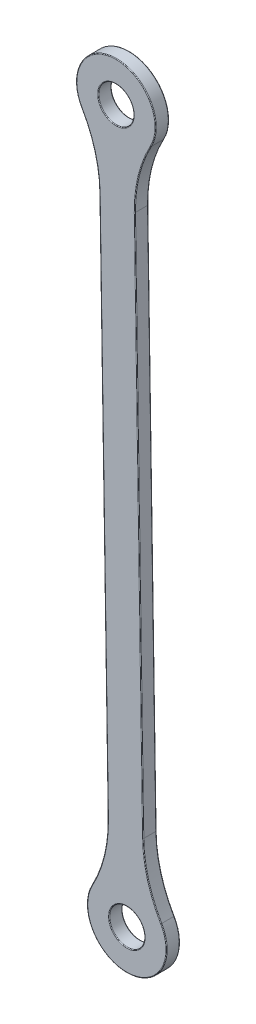
ISO-10303-21;
HEADER;
FILE_DESCRIPTION(('STEP AP214'),'2;1');
FILE_NAME('part.step','',(''),(''),'','','');
FILE_SCHEMA(('AUTOMOTIVE_DESIGN { 1 0 10303 214 1 1 1 1 }'));
ENDSEC;
DATA;
#1=APPLICATION_CONTEXT('core data for automotive mechanical design processes');
#2=APPLICATION_PROTOCOL_DEFINITION('international standard','automotive_design',2000,#1);
#3=PRODUCT_CONTEXT('',#1,'mechanical');
#4=PRODUCT('Part','Part','',(#3));
#5=PRODUCT_RELATED_PRODUCT_CATEGORY('part','',(#4));
#6=PRODUCT_DEFINITION_FORMATION('','',#4);
#7=PRODUCT_DEFINITION_CONTEXT('part definition',#1,'design');
#8=PRODUCT_DEFINITION('design','',#6,#7);
#9=PRODUCT_DEFINITION_SHAPE('','',#8);
#10=(LENGTH_UNIT() NAMED_UNIT(*) SI_UNIT(.MILLI.,.METRE.));
#11=(NAMED_UNIT(*) PLANE_ANGLE_UNIT() SI_UNIT($,.RADIAN.));
#12=(NAMED_UNIT(*) SI_UNIT($,.STERADIAN.) SOLID_ANGLE_UNIT());
#13=UNCERTAINTY_MEASURE_WITH_UNIT(LENGTH_MEASURE(1.E-05),#10,'distance_accuracy_value','');
#14=(GEOMETRIC_REPRESENTATION_CONTEXT(3) GLOBAL_UNCERTAINTY_ASSIGNED_CONTEXT((#13)) GLOBAL_UNIT_ASSIGNED_CONTEXT((#10,
#11,#12)) REPRESENTATION_CONTEXT('',''));
#15=CARTESIAN_POINT('',(0.,0.,0.));
#16=DIRECTION('',(0.,0.,1.));
#17=DIRECTION('',(1.,0.,0.));
#18=AXIS2_PLACEMENT_3D('',#15,#16,#17);
#19=CARTESIAN_POINT('',(33.7800000295671,57.2783388585903,-3.));
#20=DIRECTION('',(0.,0.,1.));
#21=DIRECTION('',(1.,0.,0.));
#22=AXIS2_PLACEMENT_3D('',#19,#20,#21);
#23=CYLINDRICAL_SURFACE('',#22,9.00000000000001);
#24=DIRECTION('',(0.,0.,1.));
#25=VECTOR('',#24,1.);
#26=CARTESIAN_POINT('',(25.8667733867678,61.5656275238999,-3.));
#27=LINE('',#26,#25);
#28=CARTESIAN_POINT('',(25.8667733867678,61.5656275238999,-0.15));
#29=VERTEX_POINT('',#28);
#30=CARTESIAN_POINT('',(25.8667733867678,61.5656275238999,-2.85));
#31=VERTEX_POINT('',#30);
#32=EDGE_CURVE('E301',#29,#31,#27,.F.);
#33=ORIENTED_EDGE('',*,*,#32,.T.);
#34=CARTESIAN_POINT('',(33.7800000295671,57.2783388585903,-2.85));
#35=DIRECTION('',(0.,0.,1.));
#36=DIRECTION('',(1.,0.,0.));
#37=AXIS2_PLACEMENT_3D('',#34,#35,#36);
#38=CIRCLE('',#37,9.00000000000001);
#39=CARTESIAN_POINT('',(41.5572141324783,61.8076810622087,-2.85));
#40=VERTEX_POINT('',#39);
#41=EDGE_CURVE('E223',#31,#40,#38,.T.);
#42=ORIENTED_EDGE('',*,*,#41,.T.);
#43=DIRECTION('',(0.,0.,1.));
#44=VECTOR('',#43,1.);
#45=CARTESIAN_POINT('',(41.5572141324783,61.8076810622087,-3.));
#46=LINE('',#45,#44);
#47=CARTESIAN_POINT('',(41.5572141324783,61.8076810622087,-0.15));
#48=VERTEX_POINT('',#47);
#49=EDGE_CURVE('E295',#40,#48,#46,.T.);
#50=ORIENTED_EDGE('',*,*,#49,.T.);
#51=CARTESIAN_POINT('',(33.7800000295671,57.2783388585903,-0.15));
#52=DIRECTION('',(0.,0.,1.));
#53=DIRECTION('',(1.,0.,0.));
#54=AXIS2_PLACEMENT_3D('',#51,#52,#53);
#55=CIRCLE('',#54,9.00000000000001);
#56=EDGE_CURVE('E221',#48,#29,#55,.F.);
#57=ORIENTED_EDGE('',*,*,#56,.T.);
#58=EDGE_LOOP('',(#33,#42,#50,#57));
#59=FACE_BOUND('',#58,.T.);
#60=ADVANCED_FACE('F35',(#59),#23,.T.);
#61=CARTESIAN_POINT('',(30.6558507811795,0.47292216144272,-3.));
#62=DIRECTION('',(0.999881027912922,0.0154249803824219,0.));
#63=DIRECTION('',(-0.0154249803824219,0.999881027912922,0.));
#64=AXIS2_PLACEMENT_3D('',#61,#62,#63);
#65=PLANE('',#64);
#66=DIRECTION('',(0.,0.,1.));
#67=VECTOR('',#66,1.);
#68=CARTESIAN_POINT('',(27.6071728933693,198.094903173027,-3.));
#69=LINE('',#68,#67);
#70=CARTESIAN_POINT('',(27.6071728933693,198.094903173027,-0.15));
#71=VERTEX_POINT('',#70);
#72=CARTESIAN_POINT('',(27.6071728933693,198.094903173027,-2.85));
#73=VERTEX_POINT('',#72);
#74=EDGE_CURVE('E258',#71,#73,#69,.F.);
#75=ORIENTED_EDGE('',*,*,#74,.T.);
#76=DIRECTION('',(-0.0154249803824219,0.999881027912922,0.));
#77=VECTOR('',#76,1.);
#78=CARTESIAN_POINT('',(30.6558507811795,0.47292216144272,-2.85));
#79=LINE('',#78,#77);
#80=CARTESIAN_POINT('',(29.4857820814914,76.3193391530712,-2.85));
#81=VERTEX_POINT('',#80);
#82=EDGE_CURVE('E215',#73,#81,#79,.F.);
#83=ORIENTED_EDGE('',*,*,#82,.T.);
#84=DIRECTION('',(0.,0.,1.));
#85=VECTOR('',#84,1.);
#86=CARTESIAN_POINT('',(29.4857820814914,76.3193391530712,-3.));
#87=LINE('',#86,#85);
#88=CARTESIAN_POINT('',(29.4857820814914,76.3193391530712,-0.15));
#89=VERTEX_POINT('',#88);
#90=EDGE_CURVE('E302',#81,#89,#87,.T.);
#91=ORIENTED_EDGE('',*,*,#90,.T.);
#92=DIRECTION('',(-0.0154249803824219,0.999881027912922,0.));
#93=VECTOR('',#92,1.);
#94=CARTESIAN_POINT('',(27.6071728933693,198.094903173027,-0.15));
#95=LINE('',#94,#93);
#96=EDGE_CURVE('E213',#89,#71,#95,.T.);
#97=ORIENTED_EDGE('',*,*,#96,.T.);
#98=EDGE_LOOP('',(#75,#83,#91,#97));
#99=FACE_BOUND('',#98,.T.);
#100=ADVANCED_FACE('F371',(#99),#65,.F.);
#101=CARTESIAN_POINT('',(31.312003168597,217.259303310567,-3.));
#102=DIRECTION('',(0.,0.,1.));
#103=DIRECTION('',(1.,0.,0.));
#104=AXIS2_PLACEMENT_3D('',#101,#102,#103);
#105=CYLINDRICAL_SURFACE('',#104,9.00000000000004);
#106=DIRECTION('',(0.,0.,1.));
#107=VECTOR('',#106,1.);
#108=CARTESIAN_POINT('',(39.2252298113962,212.972014645257,-3.));
#109=LINE('',#108,#107);
#110=CARTESIAN_POINT('',(39.2252298113962,212.972014645257,-0.15));
#111=VERTEX_POINT('',#110);
#112=CARTESIAN_POINT('',(39.2252298113962,212.972014645257,-2.85));
#113=VERTEX_POINT('',#112);
#114=EDGE_CURVE('E316',#111,#113,#109,.F.);
#115=ORIENTED_EDGE('',*,*,#114,.T.);
#116=CARTESIAN_POINT('',(31.312003168597,217.259303310567,-2.85));
#117=DIRECTION('',(0.,0.,1.));
#118=DIRECTION('',(1.,0.,0.));
#119=AXIS2_PLACEMENT_3D('',#116,#117,#118);
#120=CIRCLE('',#119,9.00000000000004);
#121=CARTESIAN_POINT('',(23.5347890656857,212.729961106949,-2.85));
#122=VERTEX_POINT('',#121);
#123=EDGE_CURVE('E206',#113,#122,#120,.T.);
#124=ORIENTED_EDGE('',*,*,#123,.T.);
#125=DIRECTION('',(0.,0.,1.));
#126=VECTOR('',#125,1.);
#127=CARTESIAN_POINT('',(23.5347890656857,212.729961106949,-3.));
#128=LINE('',#127,#126);
#129=CARTESIAN_POINT('',(23.5347890656857,212.729961106949,-0.15));
#130=VERTEX_POINT('',#129);
#131=EDGE_CURVE('E313',#122,#130,#128,.T.);
#132=ORIENTED_EDGE('',*,*,#131,.T.);
#133=CARTESIAN_POINT('',(31.312003168597,217.259303310567,-0.15));
#134=DIRECTION('',(0.,0.,1.));
#135=DIRECTION('',(1.,0.,0.));
#136=AXIS2_PLACEMENT_3D('',#133,#134,#135);
#137=CIRCLE('',#136,9.00000000000004);
#138=EDGE_CURVE('E204',#130,#111,#137,.F.);
#139=ORIENTED_EDGE('',*,*,#138,.T.);
#140=EDGE_LOOP('',(#115,#124,#132,#139));
#141=FACE_BOUND('',#140,.T.);
#142=ADVANCED_FACE('F387',(#141),#105,.T.);
#143=CARTESIAN_POINT('',(31.312003168597,217.259303310567,-3.));
#144=DIRECTION('',(0.,0.,1.));
#145=DIRECTION('',(1.,0.,0.));
#146=AXIS2_PLACEMENT_3D('',#143,#144,#145);
#147=CYLINDRICAL_SURFACE('',#146,4.);
#148=CARTESIAN_POINT('',(31.312003168597,217.259303310567,-2.85));
#149=DIRECTION('',(0.,0.,1.));
#150=DIRECTION('',(1.,0.,0.));
#151=AXIS2_PLACEMENT_3D('',#148,#149,#150);
#152=CIRCLE('',#151,4.);
#153=CARTESIAN_POINT('',(35.312003168597,217.259303310567,-2.85));
#154=VERTEX_POINT('',#153);
#155=EDGE_CURVE('E190',#154,#154,#152,.F.);
#156=ORIENTED_EDGE('',*,*,#155,.T.);
#157=EDGE_LOOP('',(#156));
#158=FACE_BOUND('',#157,.T.);
#159=CARTESIAN_POINT('',(31.312003168597,217.259303310567,-0.15));
#160=DIRECTION('',(0.,0.,1.));
#161=DIRECTION('',(1.,0.,0.));
#162=AXIS2_PLACEMENT_3D('',#159,#160,#161);
#163=CIRCLE('',#162,4.);
#164=CARTESIAN_POINT('',(35.312003168597,217.259303310567,-0.15));
#165=VERTEX_POINT('',#164);
#166=EDGE_CURVE('E187',#165,#165,#163,.T.);
#167=ORIENTED_EDGE('',*,*,#166,.T.);
#168=EDGE_LOOP('',(#167));
#169=FACE_BOUND('',#168,.T.);
#170=ADVANCED_FACE('F389',(#158,#169),#147,.F.);
#171=CARTESIAN_POINT('',(38.6548990044828,0.596322004502095,-3.));
#172=DIRECTION('',(0.999881027912922,0.0154249803824219,0.));
#173=DIRECTION('',(-0.0154249803824219,0.999881027912922,0.));
#174=AXIS2_PLACEMENT_3D('',#171,#172,#173);
#175=PLANE('',#174);
#176=DIRECTION('',(0.,0.,-1.));
#177=VECTOR('',#176,1.);
#178=CARTESIAN_POINT('',(37.4848303047948,76.4427389961306,-3.));
#179=LINE('',#178,#177);
#180=CARTESIAN_POINT('',(37.4848303047948,76.4427389961306,-0.15));
#181=VERTEX_POINT('',#180);
#182=CARTESIAN_POINT('',(37.4848303047948,76.4427389961306,-2.85));
#183=VERTEX_POINT('',#182);
#184=EDGE_CURVE('E297',#181,#183,#179,.T.);
#185=ORIENTED_EDGE('',*,*,#184,.T.);
#186=DIRECTION('',(-0.0154249803824219,0.999881027912922,0.));
#187=VECTOR('',#186,1.);
#188=CARTESIAN_POINT('',(35.6062211166727,198.218303016086,-2.85));
#189=LINE('',#188,#187);
#190=CARTESIAN_POINT('',(35.6062211166727,198.218303016086,-2.85));
#191=VERTEX_POINT('',#190);
#192=EDGE_CURVE('E198',#183,#191,#189,.T.);
#193=ORIENTED_EDGE('',*,*,#192,.T.);
#194=DIRECTION('',(0.,0.,-1.));
#195=VECTOR('',#194,1.);
#196=CARTESIAN_POINT('',(35.6062211166727,198.218303016086,0.));
#197=LINE('',#196,#195);
#198=CARTESIAN_POINT('',(35.6062211166727,198.218303016086,-0.15));
#199=VERTEX_POINT('',#198);
#200=EDGE_CURVE('E304',#191,#199,#197,.F.);
#201=ORIENTED_EDGE('',*,*,#200,.T.);
#202=DIRECTION('',(-0.0154249803824219,0.999881027912922,0.));
#203=VECTOR('',#202,1.);
#204=CARTESIAN_POINT('',(38.6548990044828,0.596322004502095,-0.15));
#205=LINE('',#204,#203);
#206=EDGE_CURVE('E196',#199,#181,#205,.F.);
#207=ORIENTED_EDGE('',*,*,#206,.T.);
#208=EDGE_LOOP('',(#185,#193,#201,#207));
#209=FACE_BOUND('',#208,.T.);
#210=ADVANCED_FACE('F342',(#209),#175,.T.);
#211=CARTESIAN_POINT('',(33.7800000295671,57.2783388585903,-3.));
#212=DIRECTION('',(0.,0.,1.));
#213=DIRECTION('',(1.,0.,0.));
#214=AXIS2_PLACEMENT_3D('',#211,#212,#213);
#215=CYLINDRICAL_SURFACE('',#214,4.);
#216=CARTESIAN_POINT('',(33.7800000295671,57.2783388585903,-2.85));
#217=DIRECTION('',(0.,0.,1.));
#218=DIRECTION('',(1.,0.,0.));
#219=AXIS2_PLACEMENT_3D('',#216,#217,#218);
#220=CIRCLE('',#219,4.);
#221=CARTESIAN_POINT('',(37.7800000295671,57.2783388585903,-2.85));
#222=VERTEX_POINT('',#221);
#223=EDGE_CURVE('E170',#222,#222,#220,.F.);
#224=ORIENTED_EDGE('',*,*,#223,.T.);
#225=EDGE_LOOP('',(#224));
#226=FACE_BOUND('',#225,.T.);
#227=CARTESIAN_POINT('',(33.7800000295671,57.2783388585903,-0.15));
#228=DIRECTION('',(0.,0.,1.));
#229=DIRECTION('',(1.,0.,0.));
#230=AXIS2_PLACEMENT_3D('',#227,#228,#229);
#231=CIRCLE('',#230,4.);
#232=CARTESIAN_POINT('',(37.7800000295671,57.2783388585903,-0.15));
#233=VERTEX_POINT('',#232);
#234=EDGE_CURVE('E319',#233,#233,#231,.T.);
#235=ORIENTED_EDGE('',*,*,#234,.T.);
#236=EDGE_LOOP('',(#235));
#237=FACE_BOUND('',#236,.T.);
#238=ADVANCED_FACE('F545',(#226,#237),#215,.F.);
#239=CARTESIAN_POINT('',(0.,0.,-3.));
#240=DIRECTION('',(0.,0.,1.));
#241=DIRECTION('',(1.,0.,0.));
#242=AXIS2_PLACEMENT_3D('',#239,#240,#241);
#243=PLANE('',#242);
#244=CARTESIAN_POINT('',(33.7800000295671,57.2783388585903,-3.));
#245=DIRECTION('',(0.,0.,1.));
#246=DIRECTION('',(1.,0.,0.));
#247=AXIS2_PLACEMENT_3D('',#244,#245,#246);
#248=CIRCLE('',#247,4.15);
#249=CARTESIAN_POINT('',(37.9300000295671,57.2783388585903,-3.));
#250=VERTEX_POINT('',#249);
#251=EDGE_CURVE('E179',#250,#250,#248,.T.);
#252=ORIENTED_EDGE('',*,*,#251,.T.);
#253=EDGE_LOOP('',(#252));
#254=FACE_BOUND('',#253,.T.);
#255=CARTESIAN_POINT('',(31.312003168597,217.259303310567,-3.));
#256=DIRECTION('',(0.,0.,1.));
#257=DIRECTION('',(1.,0.,0.));
#258=AXIS2_PLACEMENT_3D('',#255,#256,#257);
#259=CIRCLE('',#258,4.15);
#260=CARTESIAN_POINT('',(35.462003168597,217.259303310567,-3.));
#261=VERTEX_POINT('',#260);
#262=EDGE_CURVE('E176',#261,#261,#259,.T.);
#263=ORIENTED_EDGE('',*,*,#262,.T.);
#264=EDGE_LOOP('',(#263));
#265=FACE_BOUND('',#264,.T.);
#266=DIRECTION('',(-0.0154249803824219,0.999881027912922,0.));
#267=VECTOR('',#266,1.);
#268=CARTESIAN_POINT('',(37.3348481506078,76.4404252490733,-3.));
#269=LINE('',#268,#267);
#270=CARTESIAN_POINT('',(35.4562389624857,198.215989269029,-3.));
#271=VERTEX_POINT('',#270);
#272=CARTESIAN_POINT('',(37.3348481506078,76.4404252490733,-3.));
#273=VERTEX_POINT('',#272);
#274=EDGE_CURVE('E174',#271,#273,#269,.F.);
#275=ORIENTED_EDGE('',*,*,#274,.T.);
#276=CARTESIAN_POINT('',(67.4812611421824,76.9054884076033,-3.));
#277=DIRECTION('',(0.,0.,1.));
#278=DIRECTION('',(1.,0.,0.));
#279=AXIS2_PLACEMENT_3D('',#276,#277,#278);
#280=CIRCLE('',#279,30.15);
#281=CARTESIAN_POINT('',(41.4275938974298,61.7321920254817,-3.));
#282=VERTEX_POINT('',#281);
#283=EDGE_CURVE('E155',#273,#282,#280,.T.);
#284=ORIENTED_EDGE('',*,*,#283,.T.);
#285=CARTESIAN_POINT('',(33.7800000295671,57.2783388585903,-3.));
#286=DIRECTION('',(0.,0.,1.));
#287=DIRECTION('',(1.,0.,0.));
#288=AXIS2_PLACEMENT_3D('',#285,#286,#287);
#289=CIRCLE('',#288,8.85000000000001);
#290=CARTESIAN_POINT('',(25.9986604974812,61.4941727128114,-3.));
#291=VERTEX_POINT('',#290);
#292=EDGE_CURVE('E163',#282,#291,#289,.F.);
#293=ORIENTED_EDGE('',*,*,#292,.T.);
#294=CARTESIAN_POINT('',(-0.510648755896287,75.8565897415986,-3.));
#295=DIRECTION('',(0.,0.,1.));
#296=DIRECTION('',(1.,0.,0.));
#297=AXIS2_PLACEMENT_3D('',#294,#295,#296);
#298=CIRCLE('',#297,30.15);
#299=CARTESIAN_POINT('',(29.6357642356783,76.3216529001286,-3.));
#300=VERTEX_POINT('',#299);
#301=EDGE_CURVE('E169',#291,#300,#298,.T.);
#302=ORIENTED_EDGE('',*,*,#301,.T.);
#303=DIRECTION('',(-0.0154249803824219,0.999881027912922,0.));
#304=VECTOR('',#303,1.);
#305=CARTESIAN_POINT('',(30.8058329353664,0.475235908500083,-3.));
#306=LINE('',#305,#304);
#307=CARTESIAN_POINT('',(27.7571550475562,198.097216920084,-3.));
#308=VERTEX_POINT('',#307);
#309=EDGE_CURVE('E325',#300,#308,#306,.T.);
#310=ORIENTED_EDGE('',*,*,#309,.T.);
#311=CARTESIAN_POINT('',(-2.38925794401838,197.632153761554,-3.));
#312=DIRECTION('',(0.,0.,1.));
#313=DIRECTION('',(1.,0.,0.));
#314=AXIS2_PLACEMENT_3D('',#311,#312,#313);
#315=CIRCLE('',#314,30.15);
#316=CARTESIAN_POINT('',(23.6644093007342,212.805450143676,-3.));
#317=VERTEX_POINT('',#316);
#318=EDGE_CURVE('E327',#308,#317,#315,.T.);
#319=ORIENTED_EDGE('',*,*,#318,.T.);
#320=CARTESIAN_POINT('',(31.312003168597,217.259303310567,-3.));
#321=DIRECTION('',(0.,0.,1.));
#322=DIRECTION('',(1.,0.,0.));
#323=AXIS2_PLACEMENT_3D('',#320,#321,#322);
#324=CIRCLE('',#323,8.85000000000004);
#325=CARTESIAN_POINT('',(39.0933427006829,213.043469456346,-3.));
#326=VERTEX_POINT('',#325);
#327=EDGE_CURVE('E329',#317,#326,#324,.F.);
#328=ORIENTED_EDGE('',*,*,#327,.T.);
#329=CARTESIAN_POINT('',(65.6026519540603,198.681052427559,-3.));
#330=DIRECTION('',(0.,0.,1.));
#331=DIRECTION('',(1.,0.,0.));
#332=AXIS2_PLACEMENT_3D('',#329,#330,#331);
#333=CIRCLE('',#332,30.15);
#334=EDGE_CURVE('E181',#326,#271,#333,.T.);
#335=ORIENTED_EDGE('',*,*,#334,.T.);
#336=EDGE_LOOP('',(#275,#284,#293,#302,#310,#319,#328,#335));
#337=FACE_BOUND('',#336,.T.);
#338=ADVANCED_FACE('F172',(#254,#265,#337),#243,.F.);
#339=CARTESIAN_POINT('',(0.,0.,0.));
#340=DIRECTION('',(0.,0.,1.));
#341=DIRECTION('',(1.,0.,0.));
#342=AXIS2_PLACEMENT_3D('',#339,#340,#341);
#343=PLANE('',#342);
#344=CARTESIAN_POINT('',(33.7800000295671,57.2783388585903,0.));
#345=DIRECTION('',(0.,0.,1.));
#346=DIRECTION('',(1.,0.,0.));
#347=AXIS2_PLACEMENT_3D('',#344,#345,#346);
#348=CIRCLE('',#347,4.15);
#349=CARTESIAN_POINT('',(37.9300000295671,57.2783388585903,0.));
#350=VERTEX_POINT('',#349);
#351=EDGE_CURVE('E11',#350,#350,#348,.F.);
#352=ORIENTED_EDGE('',*,*,#351,.T.);
#353=EDGE_LOOP('',(#352));
#354=FACE_BOUND('',#353,.T.);
#355=CARTESIAN_POINT('',(31.312003168597,217.259303310567,0.));
#356=DIRECTION('',(0.,0.,1.));
#357=DIRECTION('',(1.,0.,0.));
#358=AXIS2_PLACEMENT_3D('',#355,#356,#357);
#359=CIRCLE('',#358,4.15);
#360=CARTESIAN_POINT('',(35.462003168597,217.259303310567,0.));
#361=VERTEX_POINT('',#360);
#362=EDGE_CURVE('E44',#361,#361,#359,.F.);
#363=ORIENTED_EDGE('',*,*,#362,.T.);
#364=EDGE_LOOP('',(#363));
#365=FACE_BOUND('',#364,.T.);
#366=CARTESIAN_POINT('',(31.312003168597,217.259303310567,0.));
#367=DIRECTION('',(0.,0.,1.));
#368=DIRECTION('',(1.,0.,0.));
#369=AXIS2_PLACEMENT_3D('',#366,#367,#368);
#370=CIRCLE('',#369,8.85000000000004);
#371=CARTESIAN_POINT('',(39.0933427006829,213.043469456346,0.));
#372=VERTEX_POINT('',#371);
#373=CARTESIAN_POINT('',(23.6644093007342,212.805450143676,0.));
#374=VERTEX_POINT('',#373);
#375=EDGE_CURVE('E52',#372,#374,#370,.T.);
#376=ORIENTED_EDGE('',*,*,#375,.T.);
#377=CARTESIAN_POINT('',(-2.38925794401838,197.632153761554,0.));
#378=DIRECTION('',(0.,0.,1.));
#379=DIRECTION('',(1.,0.,0.));
#380=AXIS2_PLACEMENT_3D('',#377,#378,#379);
#381=CIRCLE('',#380,30.15);
#382=CARTESIAN_POINT('',(27.7571550475562,198.097216920084,0.));
#383=VERTEX_POINT('',#382);
#384=EDGE_CURVE('E237',#374,#383,#381,.F.);
#385=ORIENTED_EDGE('',*,*,#384,.T.);
#386=DIRECTION('',(-0.0154249803824219,0.999881027912922,0.));
#387=VECTOR('',#386,1.);
#388=CARTESIAN_POINT('',(29.6357642356783,76.3216529001286,0.));
#389=LINE('',#388,#387);
#390=CARTESIAN_POINT('',(29.6357642356783,76.3216529001286,0.));
#391=VERTEX_POINT('',#390);
#392=EDGE_CURVE('E225',#383,#391,#389,.F.);
#393=ORIENTED_EDGE('',*,*,#392,.T.);
#394=CARTESIAN_POINT('',(-0.510648755896287,75.8565897415986,0.));
#395=DIRECTION('',(0.,0.,1.));
#396=DIRECTION('',(1.,0.,0.));
#397=AXIS2_PLACEMENT_3D('',#394,#395,#396);
#398=CIRCLE('',#397,30.15);
#399=CARTESIAN_POINT('',(25.9986604974812,61.4941727128114,0.));
#400=VERTEX_POINT('',#399);
#401=EDGE_CURVE('E227',#391,#400,#398,.F.);
#402=ORIENTED_EDGE('',*,*,#401,.T.);
#403=CARTESIAN_POINT('',(33.7800000295671,57.2783388585903,0.));
#404=DIRECTION('',(0.,0.,1.));
#405=DIRECTION('',(1.,0.,0.));
#406=AXIS2_PLACEMENT_3D('',#403,#404,#405);
#407=CIRCLE('',#406,8.85000000000001);
#408=CARTESIAN_POINT('',(41.4275938974298,61.7321920254817,0.));
#409=VERTEX_POINT('',#408);
#410=EDGE_CURVE('E229',#400,#409,#407,.T.);
#411=ORIENTED_EDGE('',*,*,#410,.T.);
#412=CARTESIAN_POINT('',(67.4812611421824,76.9054884076033,0.));
#413=DIRECTION('',(0.,0.,1.));
#414=DIRECTION('',(1.,0.,0.));
#415=AXIS2_PLACEMENT_3D('',#412,#413,#414);
#416=CIRCLE('',#415,30.15);
#417=CARTESIAN_POINT('',(37.3348481506078,76.4404252490733,0.));
#418=VERTEX_POINT('',#417);
#419=EDGE_CURVE('E231',#409,#418,#416,.F.);
#420=ORIENTED_EDGE('',*,*,#419,.T.);
#421=DIRECTION('',(-0.0154249803824219,0.999881027912922,0.));
#422=VECTOR('',#421,1.);
#423=CARTESIAN_POINT('',(38.5049168502959,0.594008257444732,0.));
#424=LINE('',#423,#422);
#425=CARTESIAN_POINT('',(35.4562389624857,198.215989269029,0.));
#426=VERTEX_POINT('',#425);
#427=EDGE_CURVE('E233',#418,#426,#424,.T.);
#428=ORIENTED_EDGE('',*,*,#427,.T.);
#429=CARTESIAN_POINT('',(65.6026519540603,198.681052427559,0.));
#430=DIRECTION('',(0.,0.,1.));
#431=DIRECTION('',(1.,0.,0.));
#432=AXIS2_PLACEMENT_3D('',#429,#430,#431);
#433=CIRCLE('',#432,30.15);
#434=EDGE_CURVE('E57',#426,#372,#433,.F.);
#435=ORIENTED_EDGE('',*,*,#434,.T.);
#436=EDGE_LOOP('',(#376,#385,#393,#402,#411,#420,#428,#435));
#437=FACE_BOUND('',#436,.T.);
#438=ADVANCED_FACE('F358',(#354,#365,#437),#343,.T.);
#439=CARTESIAN_POINT('',(-0.510648755896287,75.8565897415986,-3.));
#440=DIRECTION('',(0.,0.,1.));
#441=DIRECTION('',(1.,0.,0.));
#442=AXIS2_PLACEMENT_3D('',#439,#440,#441);
#443=CYLINDRICAL_SURFACE('',#442,30.);
#444=ORIENTED_EDGE('',*,*,#90,.F.);
#445=CARTESIAN_POINT('',(-0.510648755896287,75.8565897415986,-2.85));
#446=DIRECTION('',(0.,0.,1.));
#447=DIRECTION('',(1.,0.,0.));
#448=AXIS2_PLACEMENT_3D('',#445,#446,#447);
#449=CIRCLE('',#448,30.);
#450=EDGE_CURVE('E219',#81,#31,#449,.F.);
#451=ORIENTED_EDGE('',*,*,#450,.T.);
#452=ORIENTED_EDGE('',*,*,#32,.F.);
#453=CARTESIAN_POINT('',(-0.510648755896287,75.8565897415986,-0.15));
#454=DIRECTION('',(0.,0.,1.));
#455=DIRECTION('',(1.,0.,0.));
#456=AXIS2_PLACEMENT_3D('',#453,#454,#455);
#457=CIRCLE('',#456,30.);
#458=EDGE_CURVE('E217',#29,#89,#457,.T.);
#459=ORIENTED_EDGE('',*,*,#458,.T.);
#460=EDGE_LOOP('',(#444,#451,#452,#459));
#461=FACE_BOUND('',#460,.T.);
#462=ADVANCED_FACE('F404',(#461),#443,.F.);
#463=CARTESIAN_POINT('',(67.4812611421824,76.9054884076033,-3.));
#464=DIRECTION('',(0.,0.,1.));
#465=DIRECTION('',(1.,0.,0.));
#466=AXIS2_PLACEMENT_3D('',#463,#464,#465);
#467=CYLINDRICAL_SURFACE('',#466,30.);
#468=ORIENTED_EDGE('',*,*,#49,.F.);
#469=CARTESIAN_POINT('',(67.4812611421824,76.9054884076033,-2.85));
#470=DIRECTION('',(0.,0.,1.));
#471=DIRECTION('',(1.,0.,0.));
#472=AXIS2_PLACEMENT_3D('',#469,#470,#471);
#473=CIRCLE('',#472,30.);
#474=EDGE_CURVE('E157',#40,#183,#473,.F.);
#475=ORIENTED_EDGE('',*,*,#474,.T.);
#476=ORIENTED_EDGE('',*,*,#184,.F.);
#477=CARTESIAN_POINT('',(67.4812611421824,76.9054884076033,-0.15));
#478=DIRECTION('',(0.,0.,1.));
#479=DIRECTION('',(1.,0.,0.));
#480=AXIS2_PLACEMENT_3D('',#477,#478,#479);
#481=CIRCLE('',#480,30.);
#482=EDGE_CURVE('E193',#181,#48,#481,.T.);
#483=ORIENTED_EDGE('',*,*,#482,.T.);
#484=EDGE_LOOP('',(#468,#475,#476,#483));
#485=FACE_BOUND('',#484,.T.);
#486=ADVANCED_FACE('F294',(#485),#467,.F.);
#487=CARTESIAN_POINT('',(65.6026519540603,198.681052427559,-3.));
#488=DIRECTION('',(0.,0.,1.));
#489=DIRECTION('',(1.,0.,0.));
#490=AXIS2_PLACEMENT_3D('',#487,#488,#489);
#491=CYLINDRICAL_SURFACE('',#490,30.);
#492=ORIENTED_EDGE('',*,*,#200,.F.);
#493=CARTESIAN_POINT('',(65.6026519540603,198.681052427559,-2.85));
#494=DIRECTION('',(0.,0.,1.));
#495=DIRECTION('',(1.,0.,0.));
#496=AXIS2_PLACEMENT_3D('',#493,#494,#495);
#497=CIRCLE('',#496,30.);
#498=EDGE_CURVE('E202',#191,#113,#497,.F.);
#499=ORIENTED_EDGE('',*,*,#498,.T.);
#500=ORIENTED_EDGE('',*,*,#114,.F.);
#501=CARTESIAN_POINT('',(65.6026519540603,198.681052427559,-0.15));
#502=DIRECTION('',(0.,0.,1.));
#503=DIRECTION('',(1.,0.,0.));
#504=AXIS2_PLACEMENT_3D('',#501,#502,#503);
#505=CIRCLE('',#504,30.);
#506=EDGE_CURVE('E200',#111,#199,#505,.T.);
#507=ORIENTED_EDGE('',*,*,#506,.T.);
#508=EDGE_LOOP('',(#492,#499,#500,#507));
#509=FACE_BOUND('',#508,.T.);
#510=ADVANCED_FACE('F344',(#509),#491,.F.);
#511=CARTESIAN_POINT('',(-2.38925794401838,197.632153761554,-3.));
#512=DIRECTION('',(0.,0.,1.));
#513=DIRECTION('',(1.,0.,0.));
#514=AXIS2_PLACEMENT_3D('',#511,#512,#513);
#515=CYLINDRICAL_SURFACE('',#514,30.);
#516=ORIENTED_EDGE('',*,*,#131,.F.);
#517=CARTESIAN_POINT('',(-2.38925794401838,197.632153761554,-2.85));
#518=DIRECTION('',(0.,0.,1.));
#519=DIRECTION('',(1.,0.,0.));
#520=AXIS2_PLACEMENT_3D('',#517,#518,#519);
#521=CIRCLE('',#520,30.);
#522=EDGE_CURVE('E211',#122,#73,#521,.F.);
#523=ORIENTED_EDGE('',*,*,#522,.T.);
#524=ORIENTED_EDGE('',*,*,#74,.F.);
#525=CARTESIAN_POINT('',(-2.38925794401838,197.632153761554,-0.15));
#526=DIRECTION('',(0.,0.,1.));
#527=DIRECTION('',(1.,0.,0.));
#528=AXIS2_PLACEMENT_3D('',#525,#526,#527);
#529=CIRCLE('',#528,30.);
#530=EDGE_CURVE('E208',#71,#130,#529,.T.);
#531=ORIENTED_EDGE('',*,*,#530,.T.);
#532=EDGE_LOOP('',(#516,#523,#524,#531));
#533=FACE_BOUND('',#532,.T.);
#534=ADVANCED_FACE('F376',(#533),#515,.F.);
#535=CARTESIAN_POINT('',(33.7800000295671,57.2783388585903,-2.85));
#536=DIRECTION('',(0.,0.,1.));
#537=DIRECTION('',(1.,0.,0.));
#538=AXIS2_PLACEMENT_3D('',#535,#536,#537);
#539=TOROIDAL_SURFACE('',#538,4.15,0.15);
#540=ORIENTED_EDGE('',*,*,#251,.F.);
#541=EDGE_LOOP('',(#540));
#542=FACE_BOUND('',#541,.T.);
#543=ORIENTED_EDGE('',*,*,#223,.F.);
#544=EDGE_LOOP('',(#543));
#545=FACE_BOUND('',#544,.T.);
#546=ADVANCED_FACE('F414',(#542,#545),#539,.T.);
#547=CARTESIAN_POINT('',(31.312003168597,217.259303310567,-2.85));
#548=DIRECTION('',(0.,0.,1.));
#549=DIRECTION('',(1.,0.,0.));
#550=AXIS2_PLACEMENT_3D('',#547,#548,#549);
#551=TOROIDAL_SURFACE('',#550,4.15,0.15);
#552=ORIENTED_EDGE('',*,*,#155,.F.);
#553=EDGE_LOOP('',(#552));
#554=FACE_BOUND('',#553,.T.);
#555=ORIENTED_EDGE('',*,*,#262,.F.);
#556=EDGE_LOOP('',(#555));
#557=FACE_BOUND('',#556,.T.);
#558=ADVANCED_FACE('F417',(#554,#557),#551,.T.);
#559=CARTESIAN_POINT('',(-2.38925794401838,197.632153761554,-2.85));
#560=DIRECTION('',(0.,0.,1.));
#561=DIRECTION('',(1.,0.,0.));
#562=AXIS2_PLACEMENT_3D('',#559,#560,#561);
#563=TOROIDAL_SURFACE('',#562,30.15,0.15);
#564=CARTESIAN_POINT('',(27.7571550475562,198.097216920084,-2.85));
#565=DIRECTION('',(0.0154249803824281,-0.999881027912922,0.));
#566=DIRECTION('',(0.999881027912922,0.0154249803824281,0.));
#567=AXIS2_PLACEMENT_3D('',#564,#565,#566);
#568=CIRCLE('',#567,0.15);
#569=EDGE_CURVE('E252',#73,#308,#568,.T.);
#570=ORIENTED_EDGE('',*,*,#569,.F.);
#571=ORIENTED_EDGE('',*,*,#522,.F.);
#572=CARTESIAN_POINT('',(23.6644093007342,212.805450143676,-2.85));
#573=DIRECTION('',(-0.503260244846449,0.864134900323492,0.));
#574=DIRECTION('',(-0.864134900323492,-0.503260244846449,0.));
#575=AXIS2_PLACEMENT_3D('',#572,#573,#574);
#576=CIRCLE('',#575,0.15);
#577=EDGE_CURVE('E255',#317,#122,#576,.T.);
#578=ORIENTED_EDGE('',*,*,#577,.F.);
#579=ORIENTED_EDGE('',*,*,#318,.F.);
#580=EDGE_LOOP('',(#570,#571,#578,#579));
#581=FACE_BOUND('',#580,.T.);
#582=ADVANCED_FACE('F380',(#581),#563,.T.);
#583=CARTESIAN_POINT('',(31.312003168597,217.259303310567,-2.85));
#584=DIRECTION('',(0.,0.,1.));
#585=DIRECTION('',(1.,0.,0.));
#586=AXIS2_PLACEMENT_3D('',#583,#584,#585);
#587=TOROIDAL_SURFACE('',#586,8.85000000000004,0.15);
#588=ORIENTED_EDGE('',*,*,#577,.T.);
#589=ORIENTED_EDGE('',*,*,#123,.F.);
#590=CARTESIAN_POINT('',(39.0933427006829,213.043469456346,-2.85));
#591=DIRECTION('',(-0.476365407256668,-0.879247404755447,0.));
#592=DIRECTION('',(0.879247404755447,-0.476365407256668,0.));
#593=AXIS2_PLACEMENT_3D('',#590,#591,#592);
#594=CIRCLE('',#593,0.15);
#595=EDGE_CURVE('E249',#326,#113,#594,.T.);
#596=ORIENTED_EDGE('',*,*,#595,.F.);
#597=ORIENTED_EDGE('',*,*,#327,.F.);
#598=EDGE_LOOP('',(#588,#589,#596,#597));
#599=FACE_BOUND('',#598,.T.);
#600=ADVANCED_FACE('F385',(#599),#587,.T.);
#601=CARTESIAN_POINT('',(30.8058329353664,0.475235908500083,-2.85));
#602=DIRECTION('',(-0.0154249803824219,0.999881027912922,0.));
#603=DIRECTION('',(-0.999881027912922,-0.0154249803824219,0.));
#604=AXIS2_PLACEMENT_3D('',#601,#602,#603);
#605=CYLINDRICAL_SURFACE('',#604,0.15);
#606=ORIENTED_EDGE('',*,*,#569,.T.);
#607=ORIENTED_EDGE('',*,*,#309,.F.);
#608=CARTESIAN_POINT('',(29.6357642356783,76.3216529001286,-2.85));
#609=DIRECTION('',(0.0154249803824281,-0.999881027912922,0.));
#610=DIRECTION('',(0.999881027912922,0.0154249803824281,0.));
#611=AXIS2_PLACEMENT_3D('',#608,#609,#610);
#612=CIRCLE('',#611,0.15);
#613=EDGE_CURVE('E246',#81,#300,#612,.T.);
#614=ORIENTED_EDGE('',*,*,#613,.F.);
#615=ORIENTED_EDGE('',*,*,#82,.F.);
#616=EDGE_LOOP('',(#606,#607,#614,#615));
#617=FACE_BOUND('',#616,.T.);
#618=ADVANCED_FACE('F435',(#617),#605,.T.);
#619=CARTESIAN_POINT('',(65.6026519540603,198.681052427559,-2.85));
#620=DIRECTION('',(0.,0.,1.));
#621=DIRECTION('',(1.,0.,0.));
#622=AXIS2_PLACEMENT_3D('',#619,#620,#621);
#623=TOROIDAL_SURFACE('',#622,30.15,0.15);
#624=ORIENTED_EDGE('',*,*,#595,.T.);
#625=ORIENTED_EDGE('',*,*,#498,.F.);
#626=CARTESIAN_POINT('',(35.4562389624857,198.215989269029,-2.85));
#627=DIRECTION('',(0.0154249803824277,-0.999881027912922,0.));
#628=DIRECTION('',(0.999881027912922,0.0154249803824277,0.));
#629=AXIS2_PLACEMENT_3D('',#626,#627,#628);
#630=CIRCLE('',#629,0.15);
#631=EDGE_CURVE('E243',#271,#191,#630,.T.);
#632=ORIENTED_EDGE('',*,*,#631,.F.);
#633=ORIENTED_EDGE('',*,*,#334,.F.);
#634=EDGE_LOOP('',(#624,#625,#632,#633));
#635=FACE_BOUND('',#634,.T.);
#636=ADVANCED_FACE('F336',(#635),#623,.T.);
#637=CARTESIAN_POINT('',(-0.510648755896287,75.8565897415986,-2.85));
#638=DIRECTION('',(0.,0.,1.));
#639=DIRECTION('',(1.,0.,0.));
#640=AXIS2_PLACEMENT_3D('',#637,#638,#639);
#641=TOROIDAL_SURFACE('',#640,30.15,0.15);
#642=ORIENTED_EDGE('',*,*,#613,.T.);
#643=ORIENTED_EDGE('',*,*,#301,.F.);
#644=CARTESIAN_POINT('',(25.9986604974812,61.4941727128114,-2.85));
#645=DIRECTION('',(-0.476365407256622,-0.879247404755472,0.));
#646=DIRECTION('',(0.879247404755472,-0.476365407256622,0.));
#647=AXIS2_PLACEMENT_3D('',#644,#645,#646);
#648=CIRCLE('',#647,0.15);
#649=EDGE_CURVE('E166',#31,#291,#648,.T.);
#650=ORIENTED_EDGE('',*,*,#649,.F.);
#651=ORIENTED_EDGE('',*,*,#450,.F.);
#652=EDGE_LOOP('',(#642,#643,#650,#651));
#653=FACE_BOUND('',#652,.T.);
#654=ADVANCED_FACE('F429',(#653),#641,.T.);
#655=CARTESIAN_POINT('',(38.5049168502959,0.594008257444732,-2.85));
#656=DIRECTION('',(0.0154249803824219,-0.999881027912922,0.));
#657=DIRECTION('',(0.999881027912922,0.0154249803824219,0.));
#658=AXIS2_PLACEMENT_3D('',#655,#656,#657);
#659=CYLINDRICAL_SURFACE('',#658,0.15);
#660=ORIENTED_EDGE('',*,*,#631,.T.);
#661=ORIENTED_EDGE('',*,*,#192,.F.);
#662=CARTESIAN_POINT('',(37.3348481506078,76.4404252490733,-2.85));
#663=DIRECTION('',(0.0154249803824277,-0.999881027912922,0.));
#664=DIRECTION('',(0.999881027912922,0.0154249803824277,0.));
#665=AXIS2_PLACEMENT_3D('',#662,#663,#664);
#666=CIRCLE('',#665,0.15);
#667=EDGE_CURVE('E160',#273,#183,#666,.T.);
#668=ORIENTED_EDGE('',*,*,#667,.F.);
#669=ORIENTED_EDGE('',*,*,#274,.F.);
#670=EDGE_LOOP('',(#660,#661,#668,#669));
#671=FACE_BOUND('',#670,.T.);
#672=ADVANCED_FACE('F339',(#671),#659,.T.);
#673=CARTESIAN_POINT('',(33.7800000295671,57.2783388585903,-2.85));
#674=DIRECTION('',(0.,0.,1.));
#675=DIRECTION('',(1.,0.,0.));
#676=AXIS2_PLACEMENT_3D('',#673,#674,#675);
#677=TOROIDAL_SURFACE('',#676,8.85000000000001,0.15);
#678=ORIENTED_EDGE('',*,*,#649,.T.);
#679=ORIENTED_EDGE('',*,*,#292,.F.);
#680=CARTESIAN_POINT('',(41.4275938974298,61.7321920254817,-2.85));
#681=DIRECTION('',(-0.503260244846494,0.864134900323466,0.));
#682=DIRECTION('',(-0.864134900323466,-0.503260244846494,0.));
#683=AXIS2_PLACEMENT_3D('',#680,#681,#682);
#684=CIRCLE('',#683,0.15);
#685=EDGE_CURVE('E151',#40,#282,#684,.T.);
#686=ORIENTED_EDGE('',*,*,#685,.F.);
#687=ORIENTED_EDGE('',*,*,#41,.F.);
#688=EDGE_LOOP('',(#678,#679,#686,#687));
#689=FACE_BOUND('',#688,.T.);
#690=ADVANCED_FACE('F164',(#689),#677,.T.);
#691=CARTESIAN_POINT('',(67.4812611421824,76.9054884076033,-2.85));
#692=DIRECTION('',(0.,0.,1.));
#693=DIRECTION('',(1.,0.,0.));
#694=AXIS2_PLACEMENT_3D('',#691,#692,#693);
#695=TOROIDAL_SURFACE('',#694,30.15,0.15);
#696=ORIENTED_EDGE('',*,*,#667,.T.);
#697=ORIENTED_EDGE('',*,*,#474,.F.);
#698=ORIENTED_EDGE('',*,*,#685,.T.);
#699=ORIENTED_EDGE('',*,*,#283,.F.);
#700=EDGE_LOOP('',(#696,#697,#698,#699));
#701=FACE_BOUND('',#700,.T.);
#702=ADVANCED_FACE('F153',(#701),#695,.T.);
#703=CARTESIAN_POINT('',(33.7800000295671,57.2783388585903,-0.15));
#704=DIRECTION('',(0.,0.,1.));
#705=DIRECTION('',(1.,0.,0.));
#706=AXIS2_PLACEMENT_3D('',#703,#704,#705);
#707=TOROIDAL_SURFACE('',#706,4.15,0.15);
#708=ORIENTED_EDGE('',*,*,#234,.F.);
#709=EDGE_LOOP('',(#708));
#710=FACE_BOUND('',#709,.T.);
#711=ORIENTED_EDGE('',*,*,#351,.F.);
#712=EDGE_LOOP('',(#711));
#713=FACE_BOUND('',#712,.T.);
#714=ADVANCED_FACE('F424',(#710,#713),#707,.T.);
#715=CARTESIAN_POINT('',(31.312003168597,217.259303310567,-0.15));
#716=DIRECTION('',(0.,0.,1.));
#717=DIRECTION('',(1.,0.,0.));
#718=AXIS2_PLACEMENT_3D('',#715,#716,#717);
#719=TOROIDAL_SURFACE('',#718,4.15,0.15);
#720=ORIENTED_EDGE('',*,*,#362,.F.);
#721=EDGE_LOOP('',(#720));
#722=FACE_BOUND('',#721,.T.);
#723=ORIENTED_EDGE('',*,*,#166,.F.);
#724=EDGE_LOOP('',(#723));
#725=FACE_BOUND('',#724,.T.);
#726=ADVANCED_FACE('F445',(#722,#725),#719,.T.);
#727=CARTESIAN_POINT('',(67.4812611421824,76.9054884076033,-0.15));
#728=DIRECTION('',(0.,0.,1.));
#729=DIRECTION('',(1.,0.,0.));
#730=AXIS2_PLACEMENT_3D('',#727,#728,#729);
#731=TOROIDAL_SURFACE('',#730,30.15,0.15);
#732=CARTESIAN_POINT('',(41.4275938974298,61.7321920254817,-0.15));
#733=DIRECTION('',(0.503260244846494,-0.864134900323466,0.));
#734=DIRECTION('',(0.864134900323466,0.503260244846494,0.));
#735=AXIS2_PLACEMENT_3D('',#732,#733,#734);
#736=CIRCLE('',#735,0.15);
#737=EDGE_CURVE('E274',#48,#409,#736,.T.);
#738=ORIENTED_EDGE('',*,*,#737,.F.);
#739=ORIENTED_EDGE('',*,*,#482,.F.);
#740=CARTESIAN_POINT('',(37.3348481506078,76.4404252490733,-0.15));
#741=DIRECTION('',(-0.0154249803824277,0.999881027912922,0.));
#742=DIRECTION('',(-0.999881027912922,-0.0154249803824277,0.));
#743=AXIS2_PLACEMENT_3D('',#740,#741,#742);
#744=CIRCLE('',#743,0.15);
#745=EDGE_CURVE('E39',#418,#181,#744,.T.);
#746=ORIENTED_EDGE('',*,*,#745,.F.);
#747=ORIENTED_EDGE('',*,*,#419,.F.);
#748=EDGE_LOOP('',(#738,#739,#746,#747));
#749=FACE_BOUND('',#748,.T.);
#750=ADVANCED_FACE('F37',(#749),#731,.T.);
#751=CARTESIAN_POINT('',(38.5049168502959,0.594008257444732,-0.15));
#752=DIRECTION('',(-0.0154249803824219,0.999881027912922,0.));
#753=DIRECTION('',(-0.999881027912922,-0.0154249803824219,0.));
#754=AXIS2_PLACEMENT_3D('',#751,#752,#753);
#755=CYLINDRICAL_SURFACE('',#754,0.15);
#756=ORIENTED_EDGE('',*,*,#745,.T.);
#757=ORIENTED_EDGE('',*,*,#206,.F.);
#758=CARTESIAN_POINT('',(35.4562389624857,198.215989269029,-0.15));
#759=DIRECTION('',(-0.0154249803824285,0.999881027912922,0.));
#760=DIRECTION('',(-0.999881027912922,-0.0154249803824285,0.));
#761=AXIS2_PLACEMENT_3D('',#758,#759,#760);
#762=CIRCLE('',#761,0.15);
#763=EDGE_CURVE('E272',#426,#199,#762,.T.);
#764=ORIENTED_EDGE('',*,*,#763,.F.);
#765=ORIENTED_EDGE('',*,*,#427,.F.);
#766=EDGE_LOOP('',(#756,#757,#764,#765));
#767=FACE_BOUND('',#766,.T.);
#768=ADVANCED_FACE('F285',(#767),#755,.T.);
#769=CARTESIAN_POINT('',(33.7800000295671,57.2783388585903,-0.15));
#770=DIRECTION('',(0.,0.,1.));
#771=DIRECTION('',(1.,0.,0.));
#772=AXIS2_PLACEMENT_3D('',#769,#770,#771);
#773=TOROIDAL_SURFACE('',#772,8.85000000000001,0.15);
#774=ORIENTED_EDGE('',*,*,#737,.T.);
#775=ORIENTED_EDGE('',*,*,#410,.F.);
#776=CARTESIAN_POINT('',(25.9986604974812,61.4941727128114,-0.15));
#777=DIRECTION('',(0.476365407256622,0.879247404755472,0.));
#778=DIRECTION('',(-0.879247404755472,0.476365407256622,0.));
#779=AXIS2_PLACEMENT_3D('',#776,#777,#778);
#780=CIRCLE('',#779,0.15);
#781=EDGE_CURVE('E269',#29,#400,#780,.T.);
#782=ORIENTED_EDGE('',*,*,#781,.F.);
#783=ORIENTED_EDGE('',*,*,#56,.F.);
#784=EDGE_LOOP('',(#774,#775,#782,#783));
#785=FACE_BOUND('',#784,.T.);
#786=ADVANCED_FACE('F460',(#785),#773,.T.);
#787=CARTESIAN_POINT('',(65.6026519540603,198.681052427559,-0.15));
#788=DIRECTION('',(0.,0.,1.));
#789=DIRECTION('',(1.,0.,0.));
#790=AXIS2_PLACEMENT_3D('',#787,#788,#789);
#791=TOROIDAL_SURFACE('',#790,30.15,0.15);
#792=ORIENTED_EDGE('',*,*,#763,.T.);
#793=ORIENTED_EDGE('',*,*,#506,.F.);
#794=CARTESIAN_POINT('',(39.0933427006829,213.043469456346,-0.15));
#795=DIRECTION('',(0.476365407256668,0.879247404755447,0.));
#796=DIRECTION('',(-0.879247404755447,0.476365407256668,0.));
#797=AXIS2_PLACEMENT_3D('',#794,#795,#796);
#798=CIRCLE('',#797,0.15);
#799=EDGE_CURVE('E266',#372,#111,#798,.T.);
#800=ORIENTED_EDGE('',*,*,#799,.F.);
#801=ORIENTED_EDGE('',*,*,#434,.F.);
#802=EDGE_LOOP('',(#792,#793,#800,#801));
#803=FACE_BOUND('',#802,.T.);
#804=ADVANCED_FACE('F348',(#803),#791,.T.);
#805=CARTESIAN_POINT('',(-0.510648755896287,75.8565897415986,-0.15));
#806=DIRECTION('',(0.,0.,1.));
#807=DIRECTION('',(1.,0.,0.));
#808=AXIS2_PLACEMENT_3D('',#805,#806,#807);
#809=TOROIDAL_SURFACE('',#808,30.15,0.15);
#810=ORIENTED_EDGE('',*,*,#781,.T.);
#811=ORIENTED_EDGE('',*,*,#401,.F.);
#812=CARTESIAN_POINT('',(29.6357642356783,76.3216529001286,-0.15));
#813=DIRECTION('',(-0.0154249803824281,0.999881027912922,0.));
#814=DIRECTION('',(-0.999881027912922,-0.0154249803824281,0.));
#815=AXIS2_PLACEMENT_3D('',#812,#813,#814);
#816=CIRCLE('',#815,0.15);
#817=EDGE_CURVE('E263',#89,#391,#816,.T.);
#818=ORIENTED_EDGE('',*,*,#817,.F.);
#819=ORIENTED_EDGE('',*,*,#458,.F.);
#820=EDGE_LOOP('',(#810,#811,#818,#819));
#821=FACE_BOUND('',#820,.T.);
#822=ADVANCED_FACE('F363',(#821),#809,.T.);
#823=CARTESIAN_POINT('',(31.312003168597,217.259303310567,-0.15));
#824=DIRECTION('',(0.,0.,1.));
#825=DIRECTION('',(1.,0.,0.));
#826=AXIS2_PLACEMENT_3D('',#823,#824,#825);
#827=TOROIDAL_SURFACE('',#826,8.85000000000004,0.15);
#828=ORIENTED_EDGE('',*,*,#799,.T.);
#829=ORIENTED_EDGE('',*,*,#138,.F.);
#830=CARTESIAN_POINT('',(23.6644093007342,212.805450143676,-0.15));
#831=DIRECTION('',(0.503260244846439,-0.864134900323498,0.));
#832=DIRECTION('',(0.864134900323498,0.503260244846439,0.));
#833=AXIS2_PLACEMENT_3D('',#830,#831,#832);
#834=CIRCLE('',#833,0.15);
#835=EDGE_CURVE('E261',#374,#130,#834,.T.);
#836=ORIENTED_EDGE('',*,*,#835,.F.);
#837=ORIENTED_EDGE('',*,*,#375,.F.);
#838=EDGE_LOOP('',(#828,#829,#836,#837));
#839=FACE_BOUND('',#838,.T.);
#840=ADVANCED_FACE('F351',(#839),#827,.T.);
#841=CARTESIAN_POINT('',(30.8058329353664,0.475235908500083,-0.15));
#842=DIRECTION('',(0.0154249803824219,-0.999881027912922,0.));
#843=DIRECTION('',(0.999881027912922,0.0154249803824219,0.));
#844=AXIS2_PLACEMENT_3D('',#841,#842,#843);
#845=CYLINDRICAL_SURFACE('',#844,0.15);
#846=ORIENTED_EDGE('',*,*,#817,.T.);
#847=ORIENTED_EDGE('',*,*,#392,.F.);
#848=CARTESIAN_POINT('',(27.7571550475562,198.097216920084,-0.15));
#849=DIRECTION('',(-0.0154249803824281,0.999881027912922,0.));
#850=DIRECTION('',(-0.999881027912922,-0.0154249803824281,0.));
#851=AXIS2_PLACEMENT_3D('',#848,#849,#850);
#852=CIRCLE('',#851,0.15);
#853=EDGE_CURVE('E259',#71,#383,#852,.T.);
#854=ORIENTED_EDGE('',*,*,#853,.F.);
#855=ORIENTED_EDGE('',*,*,#96,.F.);
#856=EDGE_LOOP('',(#846,#847,#854,#855));
#857=FACE_BOUND('',#856,.T.);
#858=ADVANCED_FACE('F367',(#857),#845,.T.);
#859=CARTESIAN_POINT('',(-2.38925794401838,197.632153761554,-0.15));
#860=DIRECTION('',(0.,0.,1.));
#861=DIRECTION('',(1.,0.,0.));
#862=AXIS2_PLACEMENT_3D('',#859,#860,#861);
#863=TOROIDAL_SURFACE('',#862,30.15,0.15);
#864=ORIENTED_EDGE('',*,*,#835,.T.);
#865=ORIENTED_EDGE('',*,*,#530,.F.);
#866=ORIENTED_EDGE('',*,*,#853,.T.);
#867=ORIENTED_EDGE('',*,*,#384,.F.);
#868=EDGE_LOOP('',(#864,#865,#866,#867));
#869=FACE_BOUND('',#868,.T.);
#870=ADVANCED_FACE('F355',(#869),#863,.T.);
#871=CLOSED_SHELL('',(#60,#100,#142,#170,#210,#238,#338,#438,#462,#486,#510,#534,#546,#558,#582,
#600,#618,#636,#654,#672,#690,#702,#714,#726,#750,#768,#786,#804,#822,#840,#858,#870));
#872=MANIFOLD_SOLID_BREP('B2',#871);
#873=ADVANCED_BREP_SHAPE_REPRESENTATION('',(#18,#872),#14);
#874=SHAPE_DEFINITION_REPRESENTATION(#9,#873);
ENDSEC;
END-ISO-10303-21;
